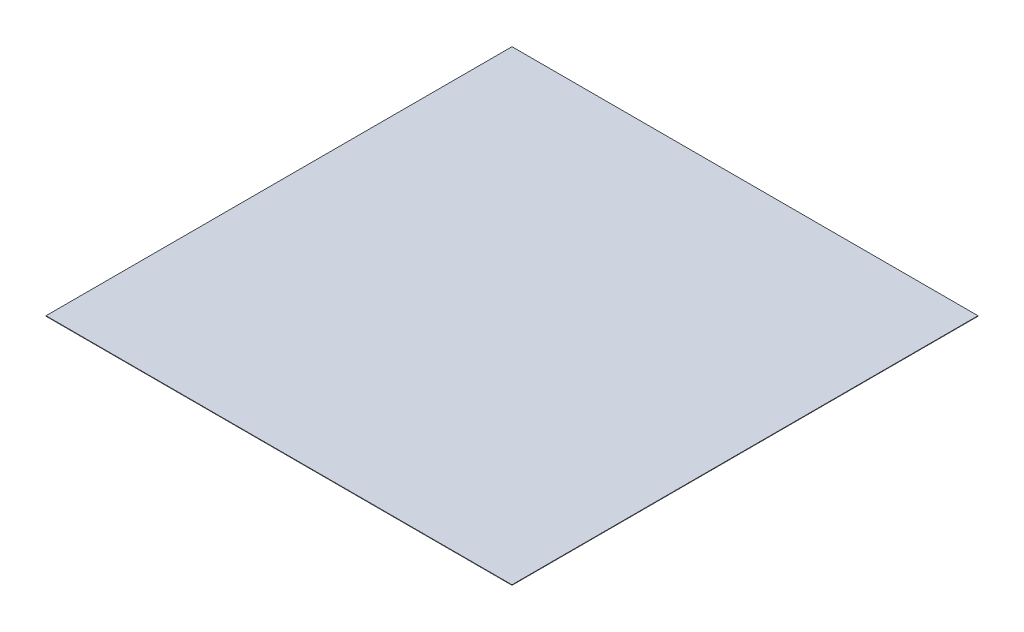
ISO-10303-21;
HEADER;
FILE_DESCRIPTION(('STEP AP214'),'2;1');
FILE_NAME('part.step','',(''),(''),'','','');
FILE_SCHEMA(('AUTOMOTIVE_DESIGN { 1 0 10303 214 1 1 1 1 }'));
ENDSEC;
DATA;
#1=APPLICATION_CONTEXT('core data for automotive mechanical design processes');
#2=APPLICATION_PROTOCOL_DEFINITION('international standard','automotive_design',2000,#1);
#3=PRODUCT_CONTEXT('',#1,'mechanical');
#4=PRODUCT('Part','Part','',(#3));
#5=PRODUCT_RELATED_PRODUCT_CATEGORY('part','',(#4));
#6=PRODUCT_DEFINITION_FORMATION('','',#4);
#7=PRODUCT_DEFINITION_CONTEXT('part definition',#1,'design');
#8=PRODUCT_DEFINITION('design','',#6,#7);
#9=PRODUCT_DEFINITION_SHAPE('','',#8);
#10=(LENGTH_UNIT() NAMED_UNIT(*) SI_UNIT(.MILLI.,.METRE.));
#11=(NAMED_UNIT(*) PLANE_ANGLE_UNIT() SI_UNIT($,.RADIAN.));
#12=(NAMED_UNIT(*) SI_UNIT($,.STERADIAN.) SOLID_ANGLE_UNIT());
#13=UNCERTAINTY_MEASURE_WITH_UNIT(LENGTH_MEASURE(1.E-05),#10,'distance_accuracy_value','');
#14=(GEOMETRIC_REPRESENTATION_CONTEXT(3) GLOBAL_UNCERTAINTY_ASSIGNED_CONTEXT((#13)) GLOBAL_UNIT_ASSIGNED_CONTEXT((#10,
#11,#12)) REPRESENTATION_CONTEXT('',''));
#15=CARTESIAN_POINT('',(0.,0.,0.));
#16=DIRECTION('',(0.,0.,1.));
#17=DIRECTION('',(1.,0.,0.));
#18=AXIS2_PLACEMENT_3D('',#15,#16,#17);
#19=CARTESIAN_POINT('',(-2033.76593279258,2.54,-1270.));
#20=DIRECTION('',(1.,0.,0.));
#21=DIRECTION('',(0.,0.,-1.));
#22=AXIS2_PLACEMENT_3D('',#19,#20,#21);
#23=PLANE('',#22);
#24=DIRECTION('',(0.,0.,1.));
#25=VECTOR('',#24,1.);
#26=CARTESIAN_POINT('',(-2033.76593279258,0.,-1270.));
#27=LINE('',#26,#25);
#28=CARTESIAN_POINT('',(-2033.76593279258,0.,-1270.));
#29=VERTEX_POINT('',#28);
#30=CARTESIAN_POINT('',(-2033.76593279258,0.,1270.));
#31=VERTEX_POINT('',#30);
#32=EDGE_CURVE('E96',#29,#31,#27,.T.);
#33=ORIENTED_EDGE('',*,*,#32,.T.);
#34=DIRECTION('',(0.,-1.,0.));
#35=VECTOR('',#34,1.);
#36=CARTESIAN_POINT('',(-2033.76593279258,2.54,1270.));
#37=LINE('',#36,#35);
#38=CARTESIAN_POINT('',(-2033.76593279258,2.54,1270.));
#39=VERTEX_POINT('',#38);
#40=EDGE_CURVE('E11',#39,#31,#37,.T.);
#41=ORIENTED_EDGE('',*,*,#40,.F.);
#42=DIRECTION('',(0.,0.,1.));
#43=VECTOR('',#42,1.);
#44=CARTESIAN_POINT('',(-2033.76593279258,2.54,-1270.));
#45=LINE('',#44,#43);
#46=CARTESIAN_POINT('',(-2033.76593279258,2.54,-1270.));
#47=VERTEX_POINT('',#46);
#48=EDGE_CURVE('E84',#47,#39,#45,.T.);
#49=ORIENTED_EDGE('',*,*,#48,.F.);
#50=DIRECTION('',(0.,-1.,0.));
#51=VECTOR('',#50,1.);
#52=CARTESIAN_POINT('',(-2033.76593279258,2.54,-1270.));
#53=LINE('',#52,#51);
#54=EDGE_CURVE('E92',#47,#29,#53,.T.);
#55=ORIENTED_EDGE('',*,*,#54,.T.);
#56=EDGE_LOOP('',(#33,#41,#49,#55));
#57=FACE_BOUND('',#56,.T.);
#58=ADVANCED_FACE('F33',(#57),#23,.F.);
#59=CARTESIAN_POINT('',(506.234067207416,2.54,1270.));
#60=DIRECTION('',(0.,0.,-1.));
#61=DIRECTION('',(-1.,0.,0.));
#62=AXIS2_PLACEMENT_3D('',#59,#60,#61);
#63=PLANE('',#62);
#64=DIRECTION('',(1.,0.,0.));
#65=VECTOR('',#64,1.);
#66=CARTESIAN_POINT('',(506.234067207416,0.,1270.));
#67=LINE('',#66,#65);
#68=CARTESIAN_POINT('',(506.234067207416,0.,1270.));
#69=VERTEX_POINT('',#68);
#70=EDGE_CURVE('E88',#31,#69,#67,.T.);
#71=ORIENTED_EDGE('',*,*,#70,.T.);
#72=DIRECTION('',(0.,-1.,0.));
#73=VECTOR('',#72,1.);
#74=CARTESIAN_POINT('',(506.234067207416,2.54,1270.));
#75=LINE('',#74,#73);
#76=CARTESIAN_POINT('',(506.234067207416,2.54,1270.));
#77=VERTEX_POINT('',#76);
#78=EDGE_CURVE('E41',#77,#69,#75,.T.);
#79=ORIENTED_EDGE('',*,*,#78,.F.);
#80=DIRECTION('',(1.,0.,0.));
#81=VECTOR('',#80,1.);
#82=CARTESIAN_POINT('',(506.234067207416,2.54,1270.));
#83=LINE('',#82,#81);
#84=EDGE_CURVE('E79',#39,#77,#83,.T.);
#85=ORIENTED_EDGE('',*,*,#84,.F.);
#86=ORIENTED_EDGE('',*,*,#40,.T.);
#87=EDGE_LOOP('',(#71,#79,#85,#86));
#88=FACE_BOUND('',#87,.T.);
#89=ADVANCED_FACE('F87',(#88),#63,.F.);
#90=CARTESIAN_POINT('',(506.234067207415,2.54,-1270.));
#91=DIRECTION('',(-1.,0.,0.));
#92=DIRECTION('',(0.,0.,1.));
#93=AXIS2_PLACEMENT_3D('',#90,#91,#92);
#94=PLANE('',#93);
#95=DIRECTION('',(0.,0.,-1.));
#96=VECTOR('',#95,1.);
#97=CARTESIAN_POINT('',(506.234067207415,0.,-1270.));
#98=LINE('',#97,#96);
#99=CARTESIAN_POINT('',(506.234067207415,0.,-1270.));
#100=VERTEX_POINT('',#99);
#101=EDGE_CURVE('E66',#69,#100,#98,.T.);
#102=ORIENTED_EDGE('',*,*,#101,.T.);
#103=DIRECTION('',(0.,-1.,0.));
#104=VECTOR('',#103,1.);
#105=CARTESIAN_POINT('',(506.234067207415,2.54,-1270.));
#106=LINE('',#105,#104);
#107=CARTESIAN_POINT('',(506.234067207415,2.54,-1270.));
#108=VERTEX_POINT('',#107);
#109=EDGE_CURVE('E89',#108,#100,#106,.T.);
#110=ORIENTED_EDGE('',*,*,#109,.F.);
#111=DIRECTION('',(0.,0.,-1.));
#112=VECTOR('',#111,1.);
#113=CARTESIAN_POINT('',(506.234067207415,2.54,-1270.));
#114=LINE('',#113,#112);
#115=EDGE_CURVE('E82',#77,#108,#114,.T.);
#116=ORIENTED_EDGE('',*,*,#115,.F.);
#117=ORIENTED_EDGE('',*,*,#78,.T.);
#118=EDGE_LOOP('',(#102,#110,#116,#117));
#119=FACE_BOUND('',#118,.T.);
#120=ADVANCED_FACE('F90',(#119),#94,.F.);
#121=CARTESIAN_POINT('',(506.234067207415,2.54,-1270.));
#122=DIRECTION('',(0.,0.,1.));
#123=DIRECTION('',(1.,0.,0.));
#124=AXIS2_PLACEMENT_3D('',#121,#122,#123);
#125=PLANE('',#124);
#126=DIRECTION('',(-1.,0.,0.));
#127=VECTOR('',#126,1.);
#128=CARTESIAN_POINT('',(506.234067207415,0.,-1270.));
#129=LINE('',#128,#127);
#130=EDGE_CURVE('E72',#100,#29,#129,.T.);
#131=ORIENTED_EDGE('',*,*,#130,.T.);
#132=ORIENTED_EDGE('',*,*,#54,.F.);
#133=DIRECTION('',(-1.,0.,0.));
#134=VECTOR('',#133,1.);
#135=CARTESIAN_POINT('',(506.234067207415,2.54,-1270.));
#136=LINE('',#135,#134);
#137=EDGE_CURVE('E49',#108,#47,#136,.T.);
#138=ORIENTED_EDGE('',*,*,#137,.F.);
#139=ORIENTED_EDGE('',*,*,#109,.T.);
#140=EDGE_LOOP('',(#131,#132,#138,#139));
#141=FACE_BOUND('',#140,.T.);
#142=ADVANCED_FACE('F103',(#141),#125,.F.);
#143=CARTESIAN_POINT('',(0.,2.54,0.));
#144=DIRECTION('',(0.,-1.,0.));
#145=DIRECTION('',(0.,0.,-1.));
#146=AXIS2_PLACEMENT_3D('',#143,#144,#145);
#147=PLANE('',#146);
#148=ORIENTED_EDGE('',*,*,#48,.T.);
#149=ORIENTED_EDGE('',*,*,#84,.T.);
#150=ORIENTED_EDGE('',*,*,#115,.T.);
#151=ORIENTED_EDGE('',*,*,#137,.T.);
#152=EDGE_LOOP('',(#148,#149,#150,#151));
#153=FACE_BOUND('',#152,.T.);
#154=ADVANCED_FACE('F80',(#153),#147,.F.);
#155=CARTESIAN_POINT('',(0.,0.,0.));
#156=DIRECTION('',(0.,-1.,0.));
#157=DIRECTION('',(0.,0.,-1.));
#158=AXIS2_PLACEMENT_3D('',#155,#156,#157);
#159=PLANE('',#158);
#160=ORIENTED_EDGE('',*,*,#32,.F.);
#161=ORIENTED_EDGE('',*,*,#130,.F.);
#162=ORIENTED_EDGE('',*,*,#101,.F.);
#163=ORIENTED_EDGE('',*,*,#70,.F.);
#164=EDGE_LOOP('',(#160,#161,#162,#163));
#165=FACE_BOUND('',#164,.T.);
#166=ADVANCED_FACE('F106',(#165),#159,.T.);
#167=CLOSED_SHELL('',(#58,#89,#120,#142,#154,#166));
#168=MANIFOLD_SOLID_BREP('B2',#167);
#169=ADVANCED_BREP_SHAPE_REPRESENTATION('',(#18,#168),#14);
#170=SHAPE_DEFINITION_REPRESENTATION(#9,#169);
ENDSEC;
END-ISO-10303-21;
